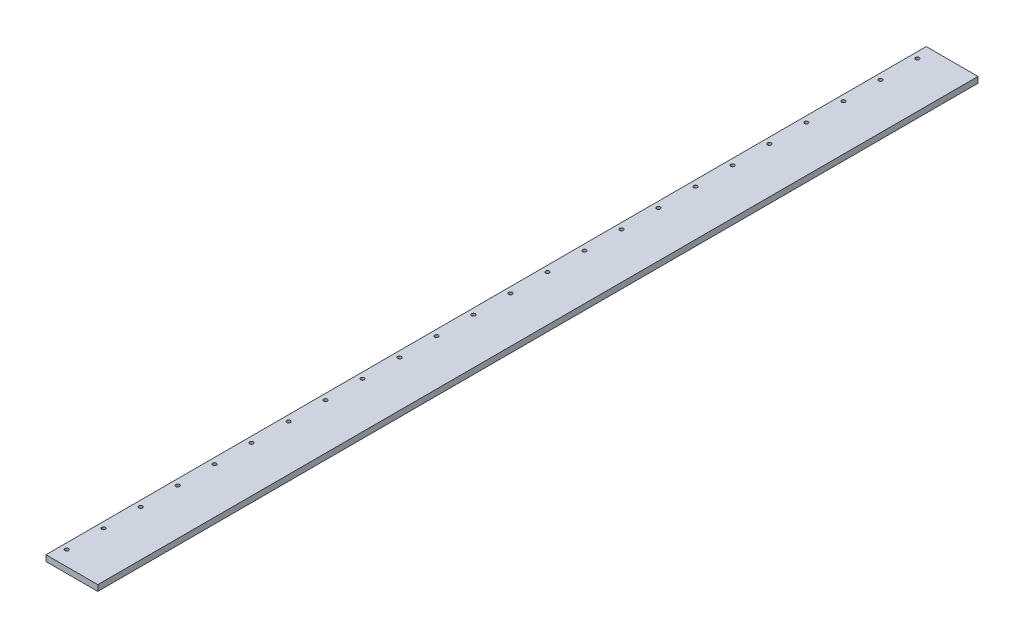
ISO-10303-21;
HEADER;
FILE_DESCRIPTION(('STEP AP214'),'2;1');
FILE_NAME('part.step','',(''),(''),'','','');
FILE_SCHEMA(('AUTOMOTIVE_DESIGN { 1 0 10303 214 1 1 1 1 }'));
ENDSEC;
DATA;
#1=APPLICATION_CONTEXT('core data for automotive mechanical design processes');
#2=APPLICATION_PROTOCOL_DEFINITION('international standard','automotive_design',2000,#1);
#3=PRODUCT_CONTEXT('',#1,'mechanical');
#4=PRODUCT('Part','Part','',(#3));
#5=PRODUCT_RELATED_PRODUCT_CATEGORY('part','',(#4));
#6=PRODUCT_DEFINITION_FORMATION('','',#4);
#7=PRODUCT_DEFINITION_CONTEXT('part definition',#1,'design');
#8=PRODUCT_DEFINITION('design','',#6,#7);
#9=PRODUCT_DEFINITION_SHAPE('','',#8);
#10=(LENGTH_UNIT() NAMED_UNIT(*) SI_UNIT(.MILLI.,.METRE.));
#11=(NAMED_UNIT(*) PLANE_ANGLE_UNIT() SI_UNIT($,.RADIAN.));
#12=(NAMED_UNIT(*) SI_UNIT($,.STERADIAN.) SOLID_ANGLE_UNIT());
#13=UNCERTAINTY_MEASURE_WITH_UNIT(LENGTH_MEASURE(1.E-05),#10,'distance_accuracy_value','');
#14=(GEOMETRIC_REPRESENTATION_CONTEXT(3) GLOBAL_UNCERTAINTY_ASSIGNED_CONTEXT((#13)) GLOBAL_UNIT_ASSIGNED_CONTEXT((#10,
#11,#12)) REPRESENTATION_CONTEXT('',''));
#15=CARTESIAN_POINT('',(0.,0.,0.));
#16=DIRECTION('',(0.,0.,1.));
#17=DIRECTION('',(1.,0.,0.));
#18=AXIS2_PLACEMENT_3D('',#15,#16,#17);
#19=CARTESIAN_POINT('',(-16.5,2.,595.));
#20=DIRECTION('',(0.,-1.,0.));
#21=DIRECTION('',(0.,0.,-1.));
#22=AXIS2_PLACEMENT_3D('',#19,#20,#21);
#23=PLANE('',#22);
#24=CARTESIAN_POINT('',(-12.5,2.,585.));
#25=DIRECTION('',(0.,1.,0.));
#26=DIRECTION('',(0.,0.,1.));
#27=AXIS2_PLACEMENT_3D('',#24,#25,#26);
#28=CIRCLE('',#27,1.24999999999999);
#29=CARTESIAN_POINT('',(-12.5,2.,586.25));
#30=VERTEX_POINT('',#29);
#31=EDGE_CURVE('E318',#30,#30,#28,.T.);
#32=ORIENTED_EDGE('',*,*,#31,.F.);
#33=EDGE_LOOP('',(#32));
#34=FACE_BOUND('',#33,.T.);
#35=CARTESIAN_POINT('',(-12.5,2.,560.));
#36=DIRECTION('',(0.,1.,0.));
#37=DIRECTION('',(0.,0.,1.));
#38=AXIS2_PLACEMENT_3D('',#35,#36,#37);
#39=CIRCLE('',#38,1.24999999999999);
#40=CARTESIAN_POINT('',(-12.5,2.,561.25));
#41=VERTEX_POINT('',#40);
#42=EDGE_CURVE('E310',#41,#41,#39,.T.);
#43=ORIENTED_EDGE('',*,*,#42,.F.);
#44=EDGE_LOOP('',(#43));
#45=FACE_BOUND('',#44,.T.);
#46=CARTESIAN_POINT('',(-12.5,2.,535.));
#47=DIRECTION('',(0.,1.,0.));
#48=DIRECTION('',(0.,0.,1.));
#49=AXIS2_PLACEMENT_3D('',#46,#47,#48);
#50=CIRCLE('',#49,1.24999999999999);
#51=CARTESIAN_POINT('',(-12.5,2.,536.25));
#52=VERTEX_POINT('',#51);
#53=EDGE_CURVE('E302',#52,#52,#50,.T.);
#54=ORIENTED_EDGE('',*,*,#53,.F.);
#55=EDGE_LOOP('',(#54));
#56=FACE_BOUND('',#55,.T.);
#57=CARTESIAN_POINT('',(-12.5,2.,510.));
#58=DIRECTION('',(0.,1.,0.));
#59=DIRECTION('',(0.,0.,1.));
#60=AXIS2_PLACEMENT_3D('',#57,#58,#59);
#61=CIRCLE('',#60,1.24999999999999);
#62=CARTESIAN_POINT('',(-12.5,2.,511.25));
#63=VERTEX_POINT('',#62);
#64=EDGE_CURVE('E294',#63,#63,#61,.T.);
#65=ORIENTED_EDGE('',*,*,#64,.F.);
#66=EDGE_LOOP('',(#65));
#67=FACE_BOUND('',#66,.T.);
#68=CARTESIAN_POINT('',(-12.5,2.,435.));
#69=DIRECTION('',(0.,1.,0.));
#70=DIRECTION('',(0.,0.,1.));
#71=AXIS2_PLACEMENT_3D('',#68,#69,#70);
#72=CIRCLE('',#71,1.24999999999999);
#73=CARTESIAN_POINT('',(-12.5,2.,436.25));
#74=VERTEX_POINT('',#73);
#75=EDGE_CURVE('E270',#74,#74,#72,.T.);
#76=ORIENTED_EDGE('',*,*,#75,.F.);
#77=EDGE_LOOP('',(#76));
#78=FACE_BOUND('',#77,.T.);
#79=CARTESIAN_POINT('',(-12.5,2.,410.));
#80=DIRECTION('',(0.,1.,0.));
#81=DIRECTION('',(0.,0.,1.));
#82=AXIS2_PLACEMENT_3D('',#79,#80,#81);
#83=CIRCLE('',#82,1.24999999999999);
#84=CARTESIAN_POINT('',(-12.5,2.,411.25));
#85=VERTEX_POINT('',#84);
#86=EDGE_CURVE('E262',#85,#85,#83,.T.);
#87=ORIENTED_EDGE('',*,*,#86,.F.);
#88=EDGE_LOOP('',(#87));
#89=FACE_BOUND('',#88,.T.);
#90=CARTESIAN_POINT('',(-12.5,2.,335.));
#91=DIRECTION('',(0.,1.,0.));
#92=DIRECTION('',(0.,0.,1.));
#93=AXIS2_PLACEMENT_3D('',#90,#91,#92);
#94=CIRCLE('',#93,1.24999999999999);
#95=CARTESIAN_POINT('',(-12.5,2.,336.25));
#96=VERTEX_POINT('',#95);
#97=EDGE_CURVE('E238',#96,#96,#94,.T.);
#98=ORIENTED_EDGE('',*,*,#97,.F.);
#99=EDGE_LOOP('',(#98));
#100=FACE_BOUND('',#99,.T.);
#101=CARTESIAN_POINT('',(-12.5,2.,310.));
#102=DIRECTION('',(0.,1.,0.));
#103=DIRECTION('',(0.,0.,1.));
#104=AXIS2_PLACEMENT_3D('',#101,#102,#103);
#105=CIRCLE('',#104,1.24999999999999);
#106=CARTESIAN_POINT('',(-12.5,2.,311.25));
#107=VERTEX_POINT('',#106);
#108=EDGE_CURVE('E230',#107,#107,#105,.T.);
#109=ORIENTED_EDGE('',*,*,#108,.F.);
#110=EDGE_LOOP('',(#109));
#111=FACE_BOUND('',#110,.T.);
#112=CARTESIAN_POINT('',(-12.5,2.,285.));
#113=DIRECTION('',(0.,1.,0.));
#114=DIRECTION('',(0.,0.,1.));
#115=AXIS2_PLACEMENT_3D('',#112,#113,#114);
#116=CIRCLE('',#115,1.24999999999999);
#117=CARTESIAN_POINT('',(-12.5,2.,286.25));
#118=VERTEX_POINT('',#117);
#119=EDGE_CURVE('E222',#118,#118,#116,.T.);
#120=ORIENTED_EDGE('',*,*,#119,.F.);
#121=EDGE_LOOP('',(#120));
#122=FACE_BOUND('',#121,.T.);
#123=CARTESIAN_POINT('',(-12.5,2.,260.));
#124=DIRECTION('',(0.,1.,0.));
#125=DIRECTION('',(0.,0.,1.));
#126=AXIS2_PLACEMENT_3D('',#123,#124,#125);
#127=CIRCLE('',#126,1.24999999999999);
#128=CARTESIAN_POINT('',(-12.5,2.,261.25));
#129=VERTEX_POINT('',#128);
#130=EDGE_CURVE('E214',#129,#129,#127,.T.);
#131=ORIENTED_EDGE('',*,*,#130,.F.);
#132=EDGE_LOOP('',(#131));
#133=FACE_BOUND('',#132,.T.);
#134=CARTESIAN_POINT('',(-12.5,2.,235.));
#135=DIRECTION('',(0.,1.,0.));
#136=DIRECTION('',(0.,0.,1.));
#137=AXIS2_PLACEMENT_3D('',#134,#135,#136);
#138=CIRCLE('',#137,1.24999999999999);
#139=CARTESIAN_POINT('',(-12.5,2.,236.25));
#140=VERTEX_POINT('',#139);
#141=EDGE_CURVE('E206',#140,#140,#138,.T.);
#142=ORIENTED_EDGE('',*,*,#141,.F.);
#143=EDGE_LOOP('',(#142));
#144=FACE_BOUND('',#143,.T.);
#145=CARTESIAN_POINT('',(-12.5,2.,210.));
#146=DIRECTION('',(0.,1.,0.));
#147=DIRECTION('',(0.,0.,1.));
#148=AXIS2_PLACEMENT_3D('',#145,#146,#147);
#149=CIRCLE('',#148,1.24999999999999);
#150=CARTESIAN_POINT('',(-12.5,2.,211.25));
#151=VERTEX_POINT('',#150);
#152=EDGE_CURVE('E198',#151,#151,#149,.T.);
#153=ORIENTED_EDGE('',*,*,#152,.F.);
#154=EDGE_LOOP('',(#153));
#155=FACE_BOUND('',#154,.T.);
#156=CARTESIAN_POINT('',(-12.5,2.,185.));
#157=DIRECTION('',(0.,1.,0.));
#158=DIRECTION('',(0.,0.,1.));
#159=AXIS2_PLACEMENT_3D('',#156,#157,#158);
#160=CIRCLE('',#159,1.24999999999999);
#161=CARTESIAN_POINT('',(-12.5,2.,186.25));
#162=VERTEX_POINT('',#161);
#163=EDGE_CURVE('E190',#162,#162,#160,.T.);
#164=ORIENTED_EDGE('',*,*,#163,.F.);
#165=EDGE_LOOP('',(#164));
#166=FACE_BOUND('',#165,.T.);
#167=CARTESIAN_POINT('',(-12.5,2.,160.));
#168=DIRECTION('',(0.,1.,0.));
#169=DIRECTION('',(0.,0.,1.));
#170=AXIS2_PLACEMENT_3D('',#167,#168,#169);
#171=CIRCLE('',#170,1.24999999999999);
#172=CARTESIAN_POINT('',(-12.5,2.,161.25));
#173=VERTEX_POINT('',#172);
#174=EDGE_CURVE('E182',#173,#173,#171,.T.);
#175=ORIENTED_EDGE('',*,*,#174,.F.);
#176=EDGE_LOOP('',(#175));
#177=FACE_BOUND('',#176,.T.);
#178=CARTESIAN_POINT('',(-12.5,2.,135.));
#179=DIRECTION('',(0.,1.,0.));
#180=DIRECTION('',(0.,0.,1.));
#181=AXIS2_PLACEMENT_3D('',#178,#179,#180);
#182=CIRCLE('',#181,1.24999999999999);
#183=CARTESIAN_POINT('',(-12.5,2.,136.25));
#184=VERTEX_POINT('',#183);
#185=EDGE_CURVE('E174',#184,#184,#182,.T.);
#186=ORIENTED_EDGE('',*,*,#185,.F.);
#187=EDGE_LOOP('',(#186));
#188=FACE_BOUND('',#187,.T.);
#189=CARTESIAN_POINT('',(-12.5,2.,110.));
#190=DIRECTION('',(0.,1.,0.));
#191=DIRECTION('',(0.,0.,1.));
#192=AXIS2_PLACEMENT_3D('',#189,#190,#191);
#193=CIRCLE('',#192,1.24999999999999);
#194=CARTESIAN_POINT('',(-12.5,2.,111.25));
#195=VERTEX_POINT('',#194);
#196=EDGE_CURVE('E166',#195,#195,#193,.T.);
#197=ORIENTED_EDGE('',*,*,#196,.F.);
#198=EDGE_LOOP('',(#197));
#199=FACE_BOUND('',#198,.T.);
#200=CARTESIAN_POINT('',(-12.5,2.,85.));
#201=DIRECTION('',(0.,1.,0.));
#202=DIRECTION('',(0.,0.,1.));
#203=AXIS2_PLACEMENT_3D('',#200,#201,#202);
#204=CIRCLE('',#203,1.24999999999999);
#205=CARTESIAN_POINT('',(-12.5,2.,86.25));
#206=VERTEX_POINT('',#205);
#207=EDGE_CURVE('E158',#206,#206,#204,.T.);
#208=ORIENTED_EDGE('',*,*,#207,.F.);
#209=EDGE_LOOP('',(#208));
#210=FACE_BOUND('',#209,.T.);
#211=CARTESIAN_POINT('',(-12.5,2.,60.));
#212=DIRECTION('',(0.,1.,0.));
#213=DIRECTION('',(0.,0.,1.));
#214=AXIS2_PLACEMENT_3D('',#211,#212,#213);
#215=CIRCLE('',#214,1.24999999999999);
#216=CARTESIAN_POINT('',(-12.5,2.,61.25));
#217=VERTEX_POINT('',#216);
#218=EDGE_CURVE('E150',#217,#217,#215,.T.);
#219=ORIENTED_EDGE('',*,*,#218,.F.);
#220=EDGE_LOOP('',(#219));
#221=FACE_BOUND('',#220,.T.);
#222=CARTESIAN_POINT('',(-12.5,2.,10.));
#223=DIRECTION('',(0.,1.,0.));
#224=DIRECTION('',(0.,0.,1.));
#225=AXIS2_PLACEMENT_3D('',#222,#223,#224);
#226=CIRCLE('',#225,1.24999999999999);
#227=CARTESIAN_POINT('',(-12.5,2.,11.25));
#228=VERTEX_POINT('',#227);
#229=EDGE_CURVE('E134',#228,#228,#226,.T.);
#230=ORIENTED_EDGE('',*,*,#229,.F.);
#231=EDGE_LOOP('',(#230));
#232=FACE_BOUND('',#231,.T.);
#233=DIRECTION('',(-1.,0.,0.));
#234=VECTOR('',#233,1.);
#235=CARTESIAN_POINT('',(-16.5,2.,0.));
#236=LINE('',#235,#234);
#237=CARTESIAN_POINT('',(18.5,2.,0.));
#238=VERTEX_POINT('',#237);
#239=CARTESIAN_POINT('',(-16.5,2.,0.));
#240=VERTEX_POINT('',#239);
#241=EDGE_CURVE('E99',#238,#240,#236,.T.);
#242=ORIENTED_EDGE('',*,*,#241,.T.);
#243=DIRECTION('',(0.,0.,-1.));
#244=VECTOR('',#243,1.);
#245=CARTESIAN_POINT('',(-16.5,2.,595.));
#246=LINE('',#245,#244);
#247=CARTESIAN_POINT('',(-16.5,2.,595.));
#248=VERTEX_POINT('',#247);
#249=EDGE_CURVE('E51',#248,#240,#246,.T.);
#250=ORIENTED_EDGE('',*,*,#249,.F.);
#251=DIRECTION('',(-1.,0.,0.));
#252=VECTOR('',#251,1.);
#253=CARTESIAN_POINT('',(-16.5,2.,595.));
#254=LINE('',#253,#252);
#255=CARTESIAN_POINT('',(18.5,2.,595.));
#256=VERTEX_POINT('',#255);
#257=EDGE_CURVE('E89',#256,#248,#254,.T.);
#258=ORIENTED_EDGE('',*,*,#257,.F.);
#259=DIRECTION('',(0.,0.,-1.));
#260=VECTOR('',#259,1.);
#261=CARTESIAN_POINT('',(18.5,2.,595.));
#262=LINE('',#261,#260);
#263=EDGE_CURVE('E11',#256,#238,#262,.T.);
#264=ORIENTED_EDGE('',*,*,#263,.T.);
#265=EDGE_LOOP('',(#242,#250,#258,#264));
#266=FACE_BOUND('',#265,.T.);
#267=CARTESIAN_POINT('',(-12.5,2.,35.));
#268=DIRECTION('',(0.,1.,0.));
#269=DIRECTION('',(0.,0.,1.));
#270=AXIS2_PLACEMENT_3D('',#267,#268,#269);
#271=CIRCLE('',#270,1.24999999999999);
#272=CARTESIAN_POINT('',(-12.5,2.,36.25));
#273=VERTEX_POINT('',#272);
#274=EDGE_CURVE('E142',#273,#273,#271,.T.);
#275=ORIENTED_EDGE('',*,*,#274,.F.);
#276=EDGE_LOOP('',(#275));
#277=FACE_BOUND('',#276,.T.);
#278=CARTESIAN_POINT('',(-12.5,2.,360.));
#279=DIRECTION('',(0.,1.,0.));
#280=DIRECTION('',(0.,0.,1.));
#281=AXIS2_PLACEMENT_3D('',#278,#279,#280);
#282=CIRCLE('',#281,1.24999999999999);
#283=CARTESIAN_POINT('',(-12.5,2.,361.25));
#284=VERTEX_POINT('',#283);
#285=EDGE_CURVE('E246',#284,#284,#282,.T.);
#286=ORIENTED_EDGE('',*,*,#285,.F.);
#287=EDGE_LOOP('',(#286));
#288=FACE_BOUND('',#287,.T.);
#289=CARTESIAN_POINT('',(-12.5,2.,385.));
#290=DIRECTION('',(0.,1.,0.));
#291=DIRECTION('',(0.,0.,1.));
#292=AXIS2_PLACEMENT_3D('',#289,#290,#291);
#293=CIRCLE('',#292,1.24999999999999);
#294=CARTESIAN_POINT('',(-12.5,2.,386.25));
#295=VERTEX_POINT('',#294);
#296=EDGE_CURVE('E254',#295,#295,#293,.T.);
#297=ORIENTED_EDGE('',*,*,#296,.F.);
#298=EDGE_LOOP('',(#297));
#299=FACE_BOUND('',#298,.T.);
#300=CARTESIAN_POINT('',(-12.5,2.,460.));
#301=DIRECTION('',(0.,1.,0.));
#302=DIRECTION('',(0.,0.,1.));
#303=AXIS2_PLACEMENT_3D('',#300,#301,#302);
#304=CIRCLE('',#303,1.24999999999999);
#305=CARTESIAN_POINT('',(-12.5,2.,461.25));
#306=VERTEX_POINT('',#305);
#307=EDGE_CURVE('E278',#306,#306,#304,.T.);
#308=ORIENTED_EDGE('',*,*,#307,.F.);
#309=EDGE_LOOP('',(#308));
#310=FACE_BOUND('',#309,.T.);
#311=CARTESIAN_POINT('',(-12.5,2.,485.));
#312=DIRECTION('',(0.,1.,0.));
#313=DIRECTION('',(0.,0.,1.));
#314=AXIS2_PLACEMENT_3D('',#311,#312,#313);
#315=CIRCLE('',#314,1.24999999999999);
#316=CARTESIAN_POINT('',(-12.5,2.,486.25));
#317=VERTEX_POINT('',#316);
#318=EDGE_CURVE('E286',#317,#317,#315,.T.);
#319=ORIENTED_EDGE('',*,*,#318,.F.);
#320=EDGE_LOOP('',(#319));
#321=FACE_BOUND('',#320,.T.);
#322=ADVANCED_FACE('F41',(#34,#45,#56,#67,#78,#89,#100,#111,#122,#133,#144,#155,#166,#177,#188,
#199,#210,#221,#232,#266,#277,#288,#299,#310,#321),#23,.F.);
#323=CARTESIAN_POINT('',(18.5,-2.,595.));
#324=DIRECTION('',(-1.,0.,0.));
#325=DIRECTION('',(0.,0.,1.));
#326=AXIS2_PLACEMENT_3D('',#323,#324,#325);
#327=PLANE('',#326);
#328=DIRECTION('',(0.,1.,0.));
#329=VECTOR('',#328,1.);
#330=CARTESIAN_POINT('',(18.5,-2.,0.));
#331=LINE('',#330,#329);
#332=CARTESIAN_POINT('',(18.5,-2.,0.));
#333=VERTEX_POINT('',#332);
#334=EDGE_CURVE('E110',#333,#238,#331,.T.);
#335=ORIENTED_EDGE('',*,*,#334,.T.);
#336=ORIENTED_EDGE('',*,*,#263,.F.);
#337=DIRECTION('',(0.,1.,0.));
#338=VECTOR('',#337,1.);
#339=CARTESIAN_POINT('',(18.5,-2.,595.));
#340=LINE('',#339,#338);
#341=CARTESIAN_POINT('',(18.5,-2.,595.));
#342=VERTEX_POINT('',#341);
#343=EDGE_CURVE('E94',#342,#256,#340,.T.);
#344=ORIENTED_EDGE('',*,*,#343,.F.);
#345=DIRECTION('',(0.,0.,-1.));
#346=VECTOR('',#345,1.);
#347=CARTESIAN_POINT('',(18.5,-2.,595.));
#348=LINE('',#347,#346);
#349=EDGE_CURVE('E106',#342,#333,#348,.T.);
#350=ORIENTED_EDGE('',*,*,#349,.T.);
#351=EDGE_LOOP('',(#335,#336,#344,#350));
#352=FACE_BOUND('',#351,.T.);
#353=ADVANCED_FACE('F43',(#352),#327,.F.);
#354=CARTESIAN_POINT('',(-16.5,-2.,595.));
#355=DIRECTION('',(1.,0.,0.));
#356=DIRECTION('',(0.,0.,-1.));
#357=AXIS2_PLACEMENT_3D('',#354,#355,#356);
#358=PLANE('',#357);
#359=DIRECTION('',(0.,-1.,0.));
#360=VECTOR('',#359,1.);
#361=CARTESIAN_POINT('',(-16.5,-2.,0.));
#362=LINE('',#361,#360);
#363=CARTESIAN_POINT('',(-16.5,-2.,0.));
#364=VERTEX_POINT('',#363);
#365=EDGE_CURVE('E76',#240,#364,#362,.T.);
#366=ORIENTED_EDGE('',*,*,#365,.T.);
#367=DIRECTION('',(0.,0.,-1.));
#368=VECTOR('',#367,1.);
#369=CARTESIAN_POINT('',(-16.5,-2.,595.));
#370=LINE('',#369,#368);
#371=CARTESIAN_POINT('',(-16.5,-2.,595.));
#372=VERTEX_POINT('',#371);
#373=EDGE_CURVE('E101',#372,#364,#370,.T.);
#374=ORIENTED_EDGE('',*,*,#373,.F.);
#375=DIRECTION('',(0.,-1.,0.));
#376=VECTOR('',#375,1.);
#377=CARTESIAN_POINT('',(-16.5,-2.,595.));
#378=LINE('',#377,#376);
#379=EDGE_CURVE('E92',#248,#372,#378,.T.);
#380=ORIENTED_EDGE('',*,*,#379,.F.);
#381=ORIENTED_EDGE('',*,*,#249,.T.);
#382=EDGE_LOOP('',(#366,#374,#380,#381));
#383=FACE_BOUND('',#382,.T.);
#384=ADVANCED_FACE('F102',(#383),#358,.F.);
#385=CARTESIAN_POINT('',(-16.5,-2.,595.));
#386=DIRECTION('',(0.,1.,0.));
#387=DIRECTION('',(0.,0.,1.));
#388=AXIS2_PLACEMENT_3D('',#385,#386,#387);
#389=PLANE('',#388);
#390=CARTESIAN_POINT('',(-12.5,-2.,585.));
#391=DIRECTION('',(0.,1.,0.));
#392=DIRECTION('',(0.,0.,1.));
#393=AXIS2_PLACEMENT_3D('',#390,#391,#392);
#394=CIRCLE('',#393,1.24999999999999);
#395=CARTESIAN_POINT('',(-12.5,-2.,586.25));
#396=VERTEX_POINT('',#395);
#397=EDGE_CURVE('E314',#396,#396,#394,.T.);
#398=ORIENTED_EDGE('',*,*,#397,.T.);
#399=EDGE_LOOP('',(#398));
#400=FACE_BOUND('',#399,.T.);
#401=CARTESIAN_POINT('',(-12.5,-2.,560.));
#402=DIRECTION('',(0.,1.,0.));
#403=DIRECTION('',(0.,0.,1.));
#404=AXIS2_PLACEMENT_3D('',#401,#402,#403);
#405=CIRCLE('',#404,1.24999999999999);
#406=CARTESIAN_POINT('',(-12.5,-2.,561.25));
#407=VERTEX_POINT('',#406);
#408=EDGE_CURVE('E306',#407,#407,#405,.T.);
#409=ORIENTED_EDGE('',*,*,#408,.T.);
#410=EDGE_LOOP('',(#409));
#411=FACE_BOUND('',#410,.T.);
#412=CARTESIAN_POINT('',(-12.5,-2.,535.));
#413=DIRECTION('',(0.,1.,0.));
#414=DIRECTION('',(0.,0.,1.));
#415=AXIS2_PLACEMENT_3D('',#412,#413,#414);
#416=CIRCLE('',#415,1.24999999999999);
#417=CARTESIAN_POINT('',(-12.5,-2.,536.25));
#418=VERTEX_POINT('',#417);
#419=EDGE_CURVE('E298',#418,#418,#416,.T.);
#420=ORIENTED_EDGE('',*,*,#419,.T.);
#421=EDGE_LOOP('',(#420));
#422=FACE_BOUND('',#421,.T.);
#423=CARTESIAN_POINT('',(-12.5,-2.,510.));
#424=DIRECTION('',(0.,1.,0.));
#425=DIRECTION('',(0.,0.,1.));
#426=AXIS2_PLACEMENT_3D('',#423,#424,#425);
#427=CIRCLE('',#426,1.24999999999999);
#428=CARTESIAN_POINT('',(-12.5,-2.,511.25));
#429=VERTEX_POINT('',#428);
#430=EDGE_CURVE('E290',#429,#429,#427,.T.);
#431=ORIENTED_EDGE('',*,*,#430,.T.);
#432=EDGE_LOOP('',(#431));
#433=FACE_BOUND('',#432,.T.);
#434=CARTESIAN_POINT('',(-12.5,-2.,485.));
#435=DIRECTION('',(0.,1.,0.));
#436=DIRECTION('',(0.,0.,1.));
#437=AXIS2_PLACEMENT_3D('',#434,#435,#436);
#438=CIRCLE('',#437,1.24999999999999);
#439=CARTESIAN_POINT('',(-12.5,-2.,486.25));
#440=VERTEX_POINT('',#439);
#441=EDGE_CURVE('E282',#440,#440,#438,.T.);
#442=ORIENTED_EDGE('',*,*,#441,.T.);
#443=EDGE_LOOP('',(#442));
#444=FACE_BOUND('',#443,.T.);
#445=CARTESIAN_POINT('',(-12.5,-2.,460.));
#446=DIRECTION('',(0.,1.,0.));
#447=DIRECTION('',(0.,0.,1.));
#448=AXIS2_PLACEMENT_3D('',#445,#446,#447);
#449=CIRCLE('',#448,1.24999999999999);
#450=CARTESIAN_POINT('',(-12.5,-2.,461.25));
#451=VERTEX_POINT('',#450);
#452=EDGE_CURVE('E274',#451,#451,#449,.T.);
#453=ORIENTED_EDGE('',*,*,#452,.T.);
#454=EDGE_LOOP('',(#453));
#455=FACE_BOUND('',#454,.T.);
#456=CARTESIAN_POINT('',(-12.5,-2.,435.));
#457=DIRECTION('',(0.,1.,0.));
#458=DIRECTION('',(0.,0.,1.));
#459=AXIS2_PLACEMENT_3D('',#456,#457,#458);
#460=CIRCLE('',#459,1.24999999999999);
#461=CARTESIAN_POINT('',(-12.5,-2.,436.25));
#462=VERTEX_POINT('',#461);
#463=EDGE_CURVE('E266',#462,#462,#460,.T.);
#464=ORIENTED_EDGE('',*,*,#463,.T.);
#465=EDGE_LOOP('',(#464));
#466=FACE_BOUND('',#465,.T.);
#467=CARTESIAN_POINT('',(-12.5,-2.,410.));
#468=DIRECTION('',(0.,1.,0.));
#469=DIRECTION('',(0.,0.,1.));
#470=AXIS2_PLACEMENT_3D('',#467,#468,#469);
#471=CIRCLE('',#470,1.24999999999999);
#472=CARTESIAN_POINT('',(-12.5,-2.,411.25));
#473=VERTEX_POINT('',#472);
#474=EDGE_CURVE('E258',#473,#473,#471,.T.);
#475=ORIENTED_EDGE('',*,*,#474,.T.);
#476=EDGE_LOOP('',(#475));
#477=FACE_BOUND('',#476,.T.);
#478=CARTESIAN_POINT('',(-12.5,-2.,385.));
#479=DIRECTION('',(0.,1.,0.));
#480=DIRECTION('',(0.,0.,1.));
#481=AXIS2_PLACEMENT_3D('',#478,#479,#480);
#482=CIRCLE('',#481,1.24999999999999);
#483=CARTESIAN_POINT('',(-12.5,-2.,386.25));
#484=VERTEX_POINT('',#483);
#485=EDGE_CURVE('E250',#484,#484,#482,.T.);
#486=ORIENTED_EDGE('',*,*,#485,.T.);
#487=EDGE_LOOP('',(#486));
#488=FACE_BOUND('',#487,.T.);
#489=CARTESIAN_POINT('',(-12.5,-2.,360.));
#490=DIRECTION('',(0.,1.,0.));
#491=DIRECTION('',(0.,0.,1.));
#492=AXIS2_PLACEMENT_3D('',#489,#490,#491);
#493=CIRCLE('',#492,1.24999999999999);
#494=CARTESIAN_POINT('',(-12.5,-2.,361.25));
#495=VERTEX_POINT('',#494);
#496=EDGE_CURVE('E242',#495,#495,#493,.T.);
#497=ORIENTED_EDGE('',*,*,#496,.T.);
#498=EDGE_LOOP('',(#497));
#499=FACE_BOUND('',#498,.T.);
#500=CARTESIAN_POINT('',(-12.5,-2.,335.));
#501=DIRECTION('',(0.,1.,0.));
#502=DIRECTION('',(0.,0.,1.));
#503=AXIS2_PLACEMENT_3D('',#500,#501,#502);
#504=CIRCLE('',#503,1.24999999999999);
#505=CARTESIAN_POINT('',(-12.5,-2.,336.25));
#506=VERTEX_POINT('',#505);
#507=EDGE_CURVE('E234',#506,#506,#504,.T.);
#508=ORIENTED_EDGE('',*,*,#507,.T.);
#509=EDGE_LOOP('',(#508));
#510=FACE_BOUND('',#509,.T.);
#511=CARTESIAN_POINT('',(-12.5,-2.,310.));
#512=DIRECTION('',(0.,1.,0.));
#513=DIRECTION('',(0.,0.,1.));
#514=AXIS2_PLACEMENT_3D('',#511,#512,#513);
#515=CIRCLE('',#514,1.24999999999999);
#516=CARTESIAN_POINT('',(-12.5,-2.,311.25));
#517=VERTEX_POINT('',#516);
#518=EDGE_CURVE('E226',#517,#517,#515,.T.);
#519=ORIENTED_EDGE('',*,*,#518,.T.);
#520=EDGE_LOOP('',(#519));
#521=FACE_BOUND('',#520,.T.);
#522=CARTESIAN_POINT('',(-12.5,-2.,285.));
#523=DIRECTION('',(0.,1.,0.));
#524=DIRECTION('',(0.,0.,1.));
#525=AXIS2_PLACEMENT_3D('',#522,#523,#524);
#526=CIRCLE('',#525,1.24999999999999);
#527=CARTESIAN_POINT('',(-12.5,-2.,286.25));
#528=VERTEX_POINT('',#527);
#529=EDGE_CURVE('E218',#528,#528,#526,.T.);
#530=ORIENTED_EDGE('',*,*,#529,.T.);
#531=EDGE_LOOP('',(#530));
#532=FACE_BOUND('',#531,.T.);
#533=CARTESIAN_POINT('',(-12.5,-2.,260.));
#534=DIRECTION('',(0.,1.,0.));
#535=DIRECTION('',(0.,0.,1.));
#536=AXIS2_PLACEMENT_3D('',#533,#534,#535);
#537=CIRCLE('',#536,1.24999999999999);
#538=CARTESIAN_POINT('',(-12.5,-2.,261.25));
#539=VERTEX_POINT('',#538);
#540=EDGE_CURVE('E210',#539,#539,#537,.T.);
#541=ORIENTED_EDGE('',*,*,#540,.T.);
#542=EDGE_LOOP('',(#541));
#543=FACE_BOUND('',#542,.T.);
#544=CARTESIAN_POINT('',(-12.5,-2.,235.));
#545=DIRECTION('',(0.,1.,0.));
#546=DIRECTION('',(0.,0.,1.));
#547=AXIS2_PLACEMENT_3D('',#544,#545,#546);
#548=CIRCLE('',#547,1.24999999999999);
#549=CARTESIAN_POINT('',(-12.5,-2.,236.25));
#550=VERTEX_POINT('',#549);
#551=EDGE_CURVE('E202',#550,#550,#548,.T.);
#552=ORIENTED_EDGE('',*,*,#551,.T.);
#553=EDGE_LOOP('',(#552));
#554=FACE_BOUND('',#553,.T.);
#555=CARTESIAN_POINT('',(-12.5,-2.,210.));
#556=DIRECTION('',(0.,1.,0.));
#557=DIRECTION('',(0.,0.,1.));
#558=AXIS2_PLACEMENT_3D('',#555,#556,#557);
#559=CIRCLE('',#558,1.24999999999999);
#560=CARTESIAN_POINT('',(-12.5,-2.,211.25));
#561=VERTEX_POINT('',#560);
#562=EDGE_CURVE('E194',#561,#561,#559,.T.);
#563=ORIENTED_EDGE('',*,*,#562,.T.);
#564=EDGE_LOOP('',(#563));
#565=FACE_BOUND('',#564,.T.);
#566=CARTESIAN_POINT('',(-12.5,-2.,185.));
#567=DIRECTION('',(0.,1.,0.));
#568=DIRECTION('',(0.,0.,1.));
#569=AXIS2_PLACEMENT_3D('',#566,#567,#568);
#570=CIRCLE('',#569,1.24999999999999);
#571=CARTESIAN_POINT('',(-12.5,-2.,186.25));
#572=VERTEX_POINT('',#571);
#573=EDGE_CURVE('E186',#572,#572,#570,.T.);
#574=ORIENTED_EDGE('',*,*,#573,.T.);
#575=EDGE_LOOP('',(#574));
#576=FACE_BOUND('',#575,.T.);
#577=CARTESIAN_POINT('',(-12.5,-2.,160.));
#578=DIRECTION('',(0.,1.,0.));
#579=DIRECTION('',(0.,0.,1.));
#580=AXIS2_PLACEMENT_3D('',#577,#578,#579);
#581=CIRCLE('',#580,1.24999999999999);
#582=CARTESIAN_POINT('',(-12.5,-2.,161.25));
#583=VERTEX_POINT('',#582);
#584=EDGE_CURVE('E178',#583,#583,#581,.T.);
#585=ORIENTED_EDGE('',*,*,#584,.T.);
#586=EDGE_LOOP('',(#585));
#587=FACE_BOUND('',#586,.T.);
#588=CARTESIAN_POINT('',(-12.5,-2.,135.));
#589=DIRECTION('',(0.,1.,0.));
#590=DIRECTION('',(0.,0.,1.));
#591=AXIS2_PLACEMENT_3D('',#588,#589,#590);
#592=CIRCLE('',#591,1.24999999999999);
#593=CARTESIAN_POINT('',(-12.5,-2.,136.25));
#594=VERTEX_POINT('',#593);
#595=EDGE_CURVE('E170',#594,#594,#592,.T.);
#596=ORIENTED_EDGE('',*,*,#595,.T.);
#597=EDGE_LOOP('',(#596));
#598=FACE_BOUND('',#597,.T.);
#599=CARTESIAN_POINT('',(-12.5,-2.,110.));
#600=DIRECTION('',(0.,1.,0.));
#601=DIRECTION('',(0.,0.,1.));
#602=AXIS2_PLACEMENT_3D('',#599,#600,#601);
#603=CIRCLE('',#602,1.24999999999999);
#604=CARTESIAN_POINT('',(-12.5,-2.,111.25));
#605=VERTEX_POINT('',#604);
#606=EDGE_CURVE('E162',#605,#605,#603,.T.);
#607=ORIENTED_EDGE('',*,*,#606,.T.);
#608=EDGE_LOOP('',(#607));
#609=FACE_BOUND('',#608,.T.);
#610=CARTESIAN_POINT('',(-12.5,-2.,85.));
#611=DIRECTION('',(0.,1.,0.));
#612=DIRECTION('',(0.,0.,1.));
#613=AXIS2_PLACEMENT_3D('',#610,#611,#612);
#614=CIRCLE('',#613,1.24999999999999);
#615=CARTESIAN_POINT('',(-12.5,-2.,86.25));
#616=VERTEX_POINT('',#615);
#617=EDGE_CURVE('E154',#616,#616,#614,.T.);
#618=ORIENTED_EDGE('',*,*,#617,.T.);
#619=EDGE_LOOP('',(#618));
#620=FACE_BOUND('',#619,.T.);
#621=CARTESIAN_POINT('',(-12.5,-2.,60.));
#622=DIRECTION('',(0.,1.,0.));
#623=DIRECTION('',(0.,0.,1.));
#624=AXIS2_PLACEMENT_3D('',#621,#622,#623);
#625=CIRCLE('',#624,1.24999999999999);
#626=CARTESIAN_POINT('',(-12.5,-2.,61.25));
#627=VERTEX_POINT('',#626);
#628=EDGE_CURVE('E146',#627,#627,#625,.T.);
#629=ORIENTED_EDGE('',*,*,#628,.T.);
#630=EDGE_LOOP('',(#629));
#631=FACE_BOUND('',#630,.T.);
#632=CARTESIAN_POINT('',(-12.5,-2.,35.));
#633=DIRECTION('',(0.,1.,0.));
#634=DIRECTION('',(0.,0.,1.));
#635=AXIS2_PLACEMENT_3D('',#632,#633,#634);
#636=CIRCLE('',#635,1.24999999999999);
#637=CARTESIAN_POINT('',(-12.5,-2.,36.25));
#638=VERTEX_POINT('',#637);
#639=EDGE_CURVE('E138',#638,#638,#636,.T.);
#640=ORIENTED_EDGE('',*,*,#639,.T.);
#641=EDGE_LOOP('',(#640));
#642=FACE_BOUND('',#641,.T.);
#643=CARTESIAN_POINT('',(-12.5,-2.,10.));
#644=DIRECTION('',(0.,1.,0.));
#645=DIRECTION('',(0.,0.,1.));
#646=AXIS2_PLACEMENT_3D('',#643,#644,#645);
#647=CIRCLE('',#646,1.24999999999999);
#648=CARTESIAN_POINT('',(-12.5,-2.,11.25));
#649=VERTEX_POINT('',#648);
#650=EDGE_CURVE('E114',#649,#649,#647,.T.);
#651=ORIENTED_EDGE('',*,*,#650,.T.);
#652=EDGE_LOOP('',(#651));
#653=FACE_BOUND('',#652,.T.);
#654=DIRECTION('',(1.,0.,0.));
#655=VECTOR('',#654,1.);
#656=CARTESIAN_POINT('',(-16.5,-2.,0.));
#657=LINE('',#656,#655);
#658=EDGE_CURVE('E82',#364,#333,#657,.T.);
#659=ORIENTED_EDGE('',*,*,#658,.T.);
#660=ORIENTED_EDGE('',*,*,#349,.F.);
#661=DIRECTION('',(1.,0.,0.));
#662=VECTOR('',#661,1.);
#663=CARTESIAN_POINT('',(-16.5,-2.,595.));
#664=LINE('',#663,#662);
#665=EDGE_CURVE('E59',#372,#342,#664,.T.);
#666=ORIENTED_EDGE('',*,*,#665,.F.);
#667=ORIENTED_EDGE('',*,*,#373,.T.);
#668=EDGE_LOOP('',(#659,#660,#666,#667));
#669=FACE_BOUND('',#668,.T.);
#670=ADVANCED_FACE('F124',(#400,#411,#422,#433,#444,#455,#466,#477,#488,#499,#510,#521,#532,
#543,#554,#565,#576,#587,#598,#609,#620,#631,#642,#653,#669),#389,.F.);
#671=CARTESIAN_POINT('',(0.,0.,595.));
#672=DIRECTION('',(0.,0.,-1.));
#673=DIRECTION('',(-1.,0.,0.));
#674=AXIS2_PLACEMENT_3D('',#671,#672,#673);
#675=PLANE('',#674);
#676=ORIENTED_EDGE('',*,*,#343,.T.);
#677=ORIENTED_EDGE('',*,*,#257,.T.);
#678=ORIENTED_EDGE('',*,*,#379,.T.);
#679=ORIENTED_EDGE('',*,*,#665,.T.);
#680=EDGE_LOOP('',(#676,#677,#678,#679));
#681=FACE_BOUND('',#680,.T.);
#682=ADVANCED_FACE('F90',(#681),#675,.F.);
#683=CARTESIAN_POINT('',(0.,0.,0.));
#684=DIRECTION('',(0.,0.,-1.));
#685=DIRECTION('',(-1.,0.,0.));
#686=AXIS2_PLACEMENT_3D('',#683,#684,#685);
#687=PLANE('',#686);
#688=ORIENTED_EDGE('',*,*,#334,.F.);
#689=ORIENTED_EDGE('',*,*,#658,.F.);
#690=ORIENTED_EDGE('',*,*,#365,.F.);
#691=ORIENTED_EDGE('',*,*,#241,.F.);
#692=EDGE_LOOP('',(#688,#689,#690,#691));
#693=FACE_BOUND('',#692,.T.);
#694=ADVANCED_FACE('F127',(#693),#687,.T.);
#695=CARTESIAN_POINT('',(-12.5,2.,10.));
#696=DIRECTION('',(0.,1.,0.));
#697=DIRECTION('',(0.,0.,1.));
#698=AXIS2_PLACEMENT_3D('',#695,#696,#697);
#699=CYLINDRICAL_SURFACE('',#698,1.24999999999999);
#700=ORIENTED_EDGE('',*,*,#650,.F.);
#701=EDGE_LOOP('',(#700));
#702=FACE_BOUND('',#701,.T.);
#703=ORIENTED_EDGE('',*,*,#229,.T.);
#704=EDGE_LOOP('',(#703));
#705=FACE_BOUND('',#704,.T.);
#706=ADVANCED_FACE('F363',(#702,#705),#699,.F.);
#707=CARTESIAN_POINT('',(-12.5,2.,35.));
#708=DIRECTION('',(0.,1.,0.));
#709=DIRECTION('',(0.,0.,1.));
#710=AXIS2_PLACEMENT_3D('',#707,#708,#709);
#711=CYLINDRICAL_SURFACE('',#710,1.24999999999999);
#712=ORIENTED_EDGE('',*,*,#639,.F.);
#713=EDGE_LOOP('',(#712));
#714=FACE_BOUND('',#713,.T.);
#715=ORIENTED_EDGE('',*,*,#274,.T.);
#716=EDGE_LOOP('',(#715));
#717=FACE_BOUND('',#716,.T.);
#718=ADVANCED_FACE('F365',(#714,#717),#711,.F.);
#719=CARTESIAN_POINT('',(-12.5,2.,60.));
#720=DIRECTION('',(0.,1.,0.));
#721=DIRECTION('',(0.,0.,1.));
#722=AXIS2_PLACEMENT_3D('',#719,#720,#721);
#723=CYLINDRICAL_SURFACE('',#722,1.24999999999999);
#724=ORIENTED_EDGE('',*,*,#628,.F.);
#725=EDGE_LOOP('',(#724));
#726=FACE_BOUND('',#725,.T.);
#727=ORIENTED_EDGE('',*,*,#218,.T.);
#728=EDGE_LOOP('',(#727));
#729=FACE_BOUND('',#728,.T.);
#730=ADVANCED_FACE('F372',(#726,#729),#723,.F.);
#731=CARTESIAN_POINT('',(-12.5,2.,85.));
#732=DIRECTION('',(0.,1.,0.));
#733=DIRECTION('',(0.,0.,1.));
#734=AXIS2_PLACEMENT_3D('',#731,#732,#733);
#735=CYLINDRICAL_SURFACE('',#734,1.24999999999999);
#736=ORIENTED_EDGE('',*,*,#617,.F.);
#737=EDGE_LOOP('',(#736));
#738=FACE_BOUND('',#737,.T.);
#739=ORIENTED_EDGE('',*,*,#207,.T.);
#740=EDGE_LOOP('',(#739));
#741=FACE_BOUND('',#740,.T.);
#742=ADVANCED_FACE('F423',(#738,#741),#735,.F.);
#743=CARTESIAN_POINT('',(-12.5,2.,110.));
#744=DIRECTION('',(0.,1.,0.));
#745=DIRECTION('',(0.,0.,1.));
#746=AXIS2_PLACEMENT_3D('',#743,#744,#745);
#747=CYLINDRICAL_SURFACE('',#746,1.24999999999999);
#748=ORIENTED_EDGE('',*,*,#606,.F.);
#749=EDGE_LOOP('',(#748));
#750=FACE_BOUND('',#749,.T.);
#751=ORIENTED_EDGE('',*,*,#196,.T.);
#752=EDGE_LOOP('',(#751));
#753=FACE_BOUND('',#752,.T.);
#754=ADVANCED_FACE('F433',(#750,#753),#747,.F.);
#755=CARTESIAN_POINT('',(-12.5,2.,135.));
#756=DIRECTION('',(0.,1.,0.));
#757=DIRECTION('',(0.,0.,1.));
#758=AXIS2_PLACEMENT_3D('',#755,#756,#757);
#759=CYLINDRICAL_SURFACE('',#758,1.24999999999999);
#760=ORIENTED_EDGE('',*,*,#595,.F.);
#761=EDGE_LOOP('',(#760));
#762=FACE_BOUND('',#761,.T.);
#763=ORIENTED_EDGE('',*,*,#185,.T.);
#764=EDGE_LOOP('',(#763));
#765=FACE_BOUND('',#764,.T.);
#766=ADVANCED_FACE('F444',(#762,#765),#759,.F.);
#767=CARTESIAN_POINT('',(-12.5,2.,160.));
#768=DIRECTION('',(0.,1.,0.));
#769=DIRECTION('',(0.,0.,1.));
#770=AXIS2_PLACEMENT_3D('',#767,#768,#769);
#771=CYLINDRICAL_SURFACE('',#770,1.24999999999999);
#772=ORIENTED_EDGE('',*,*,#584,.F.);
#773=EDGE_LOOP('',(#772));
#774=FACE_BOUND('',#773,.T.);
#775=ORIENTED_EDGE('',*,*,#174,.T.);
#776=EDGE_LOOP('',(#775));
#777=FACE_BOUND('',#776,.T.);
#778=ADVANCED_FACE('F455',(#774,#777),#771,.F.);
#779=CARTESIAN_POINT('',(-12.5,2.,185.));
#780=DIRECTION('',(0.,1.,0.));
#781=DIRECTION('',(0.,0.,1.));
#782=AXIS2_PLACEMENT_3D('',#779,#780,#781);
#783=CYLINDRICAL_SURFACE('',#782,1.24999999999999);
#784=ORIENTED_EDGE('',*,*,#573,.F.);
#785=EDGE_LOOP('',(#784));
#786=FACE_BOUND('',#785,.T.);
#787=ORIENTED_EDGE('',*,*,#163,.T.);
#788=EDGE_LOOP('',(#787));
#789=FACE_BOUND('',#788,.T.);
#790=ADVANCED_FACE('F466',(#786,#789),#783,.F.);
#791=CARTESIAN_POINT('',(-12.5,2.,210.));
#792=DIRECTION('',(0.,1.,0.));
#793=DIRECTION('',(0.,0.,1.));
#794=AXIS2_PLACEMENT_3D('',#791,#792,#793);
#795=CYLINDRICAL_SURFACE('',#794,1.24999999999999);
#796=ORIENTED_EDGE('',*,*,#562,.F.);
#797=EDGE_LOOP('',(#796));
#798=FACE_BOUND('',#797,.T.);
#799=ORIENTED_EDGE('',*,*,#152,.T.);
#800=EDGE_LOOP('',(#799));
#801=FACE_BOUND('',#800,.T.);
#802=ADVANCED_FACE('F477',(#798,#801),#795,.F.);
#803=CARTESIAN_POINT('',(-12.5,2.,235.));
#804=DIRECTION('',(0.,1.,0.));
#805=DIRECTION('',(0.,0.,1.));
#806=AXIS2_PLACEMENT_3D('',#803,#804,#805);
#807=CYLINDRICAL_SURFACE('',#806,1.24999999999999);
#808=ORIENTED_EDGE('',*,*,#551,.F.);
#809=EDGE_LOOP('',(#808));
#810=FACE_BOUND('',#809,.T.);
#811=ORIENTED_EDGE('',*,*,#141,.T.);
#812=EDGE_LOOP('',(#811));
#813=FACE_BOUND('',#812,.T.);
#814=ADVANCED_FACE('F488',(#810,#813),#807,.F.);
#815=CARTESIAN_POINT('',(-12.5,2.,260.));
#816=DIRECTION('',(0.,1.,0.));
#817=DIRECTION('',(0.,0.,1.));
#818=AXIS2_PLACEMENT_3D('',#815,#816,#817);
#819=CYLINDRICAL_SURFACE('',#818,1.24999999999999);
#820=ORIENTED_EDGE('',*,*,#540,.F.);
#821=EDGE_LOOP('',(#820));
#822=FACE_BOUND('',#821,.T.);
#823=ORIENTED_EDGE('',*,*,#130,.T.);
#824=EDGE_LOOP('',(#823));
#825=FACE_BOUND('',#824,.T.);
#826=ADVANCED_FACE('F499',(#822,#825),#819,.F.);
#827=CARTESIAN_POINT('',(-12.5,2.,285.));
#828=DIRECTION('',(0.,1.,0.));
#829=DIRECTION('',(0.,0.,1.));
#830=AXIS2_PLACEMENT_3D('',#827,#828,#829);
#831=CYLINDRICAL_SURFACE('',#830,1.24999999999999);
#832=ORIENTED_EDGE('',*,*,#529,.F.);
#833=EDGE_LOOP('',(#832));
#834=FACE_BOUND('',#833,.T.);
#835=ORIENTED_EDGE('',*,*,#119,.T.);
#836=EDGE_LOOP('',(#835));
#837=FACE_BOUND('',#836,.T.);
#838=ADVANCED_FACE('F510',(#834,#837),#831,.F.);
#839=CARTESIAN_POINT('',(-12.5,2.,310.));
#840=DIRECTION('',(0.,1.,0.));
#841=DIRECTION('',(0.,0.,1.));
#842=AXIS2_PLACEMENT_3D('',#839,#840,#841);
#843=CYLINDRICAL_SURFACE('',#842,1.24999999999999);
#844=ORIENTED_EDGE('',*,*,#518,.F.);
#845=EDGE_LOOP('',(#844));
#846=FACE_BOUND('',#845,.T.);
#847=ORIENTED_EDGE('',*,*,#108,.T.);
#848=EDGE_LOOP('',(#847));
#849=FACE_BOUND('',#848,.T.);
#850=ADVANCED_FACE('F521',(#846,#849),#843,.F.);
#851=CARTESIAN_POINT('',(-12.5,2.,335.));
#852=DIRECTION('',(0.,1.,0.));
#853=DIRECTION('',(0.,0.,1.));
#854=AXIS2_PLACEMENT_3D('',#851,#852,#853);
#855=CYLINDRICAL_SURFACE('',#854,1.24999999999999);
#856=ORIENTED_EDGE('',*,*,#507,.F.);
#857=EDGE_LOOP('',(#856));
#858=FACE_BOUND('',#857,.T.);
#859=ORIENTED_EDGE('',*,*,#97,.T.);
#860=EDGE_LOOP('',(#859));
#861=FACE_BOUND('',#860,.T.);
#862=ADVANCED_FACE('F532',(#858,#861),#855,.F.);
#863=CARTESIAN_POINT('',(-12.5,2.,360.));
#864=DIRECTION('',(0.,1.,0.));
#865=DIRECTION('',(0.,0.,1.));
#866=AXIS2_PLACEMENT_3D('',#863,#864,#865);
#867=CYLINDRICAL_SURFACE('',#866,1.24999999999999);
#868=ORIENTED_EDGE('',*,*,#496,.F.);
#869=EDGE_LOOP('',(#868));
#870=FACE_BOUND('',#869,.T.);
#871=ORIENTED_EDGE('',*,*,#285,.T.);
#872=EDGE_LOOP('',(#871));
#873=FACE_BOUND('',#872,.T.);
#874=ADVANCED_FACE('F543',(#870,#873),#867,.F.);
#875=CARTESIAN_POINT('',(-12.5,2.,385.));
#876=DIRECTION('',(0.,1.,0.));
#877=DIRECTION('',(0.,0.,1.));
#878=AXIS2_PLACEMENT_3D('',#875,#876,#877);
#879=CYLINDRICAL_SURFACE('',#878,1.24999999999999);
#880=ORIENTED_EDGE('',*,*,#485,.F.);
#881=EDGE_LOOP('',(#880));
#882=FACE_BOUND('',#881,.T.);
#883=ORIENTED_EDGE('',*,*,#296,.T.);
#884=EDGE_LOOP('',(#883));
#885=FACE_BOUND('',#884,.T.);
#886=ADVANCED_FACE('F554',(#882,#885),#879,.F.);
#887=CARTESIAN_POINT('',(-12.5,2.,410.));
#888=DIRECTION('',(0.,1.,0.));
#889=DIRECTION('',(0.,0.,1.));
#890=AXIS2_PLACEMENT_3D('',#887,#888,#889);
#891=CYLINDRICAL_SURFACE('',#890,1.24999999999999);
#892=ORIENTED_EDGE('',*,*,#474,.F.);
#893=EDGE_LOOP('',(#892));
#894=FACE_BOUND('',#893,.T.);
#895=ORIENTED_EDGE('',*,*,#86,.T.);
#896=EDGE_LOOP('',(#895));
#897=FACE_BOUND('',#896,.T.);
#898=ADVANCED_FACE('F565',(#894,#897),#891,.F.);
#899=CARTESIAN_POINT('',(-12.5,2.,435.));
#900=DIRECTION('',(0.,1.,0.));
#901=DIRECTION('',(0.,0.,1.));
#902=AXIS2_PLACEMENT_3D('',#899,#900,#901);
#903=CYLINDRICAL_SURFACE('',#902,1.24999999999999);
#904=ORIENTED_EDGE('',*,*,#463,.F.);
#905=EDGE_LOOP('',(#904));
#906=FACE_BOUND('',#905,.T.);
#907=ORIENTED_EDGE('',*,*,#75,.T.);
#908=EDGE_LOOP('',(#907));
#909=FACE_BOUND('',#908,.T.);
#910=ADVANCED_FACE('F576',(#906,#909),#903,.F.);
#911=CARTESIAN_POINT('',(-12.5,2.,460.));
#912=DIRECTION('',(0.,1.,0.));
#913=DIRECTION('',(0.,0.,1.));
#914=AXIS2_PLACEMENT_3D('',#911,#912,#913);
#915=CYLINDRICAL_SURFACE('',#914,1.24999999999999);
#916=ORIENTED_EDGE('',*,*,#452,.F.);
#917=EDGE_LOOP('',(#916));
#918=FACE_BOUND('',#917,.T.);
#919=ORIENTED_EDGE('',*,*,#307,.T.);
#920=EDGE_LOOP('',(#919));
#921=FACE_BOUND('',#920,.T.);
#922=ADVANCED_FACE('F587',(#918,#921),#915,.F.);
#923=CARTESIAN_POINT('',(-12.5,2.,485.));
#924=DIRECTION('',(0.,1.,0.));
#925=DIRECTION('',(0.,0.,1.));
#926=AXIS2_PLACEMENT_3D('',#923,#924,#925);
#927=CYLINDRICAL_SURFACE('',#926,1.24999999999999);
#928=ORIENTED_EDGE('',*,*,#441,.F.);
#929=EDGE_LOOP('',(#928));
#930=FACE_BOUND('',#929,.T.);
#931=ORIENTED_EDGE('',*,*,#318,.T.);
#932=EDGE_LOOP('',(#931));
#933=FACE_BOUND('',#932,.T.);
#934=ADVANCED_FACE('F598',(#930,#933),#927,.F.);
#935=CARTESIAN_POINT('',(-12.5,2.,510.));
#936=DIRECTION('',(0.,1.,0.));
#937=DIRECTION('',(0.,0.,1.));
#938=AXIS2_PLACEMENT_3D('',#935,#936,#937);
#939=CYLINDRICAL_SURFACE('',#938,1.24999999999999);
#940=ORIENTED_EDGE('',*,*,#430,.F.);
#941=EDGE_LOOP('',(#940));
#942=FACE_BOUND('',#941,.T.);
#943=ORIENTED_EDGE('',*,*,#64,.T.);
#944=EDGE_LOOP('',(#943));
#945=FACE_BOUND('',#944,.T.);
#946=ADVANCED_FACE('F609',(#942,#945),#939,.F.);
#947=CARTESIAN_POINT('',(-12.5,2.,535.));
#948=DIRECTION('',(0.,1.,0.));
#949=DIRECTION('',(0.,0.,1.));
#950=AXIS2_PLACEMENT_3D('',#947,#948,#949);
#951=CYLINDRICAL_SURFACE('',#950,1.24999999999999);
#952=ORIENTED_EDGE('',*,*,#419,.F.);
#953=EDGE_LOOP('',(#952));
#954=FACE_BOUND('',#953,.T.);
#955=ORIENTED_EDGE('',*,*,#53,.T.);
#956=EDGE_LOOP('',(#955));
#957=FACE_BOUND('',#956,.T.);
#958=ADVANCED_FACE('F620',(#954,#957),#951,.F.);
#959=CARTESIAN_POINT('',(-12.5,2.,560.));
#960=DIRECTION('',(0.,1.,0.));
#961=DIRECTION('',(0.,0.,1.));
#962=AXIS2_PLACEMENT_3D('',#959,#960,#961);
#963=CYLINDRICAL_SURFACE('',#962,1.24999999999999);
#964=ORIENTED_EDGE('',*,*,#408,.F.);
#965=EDGE_LOOP('',(#964));
#966=FACE_BOUND('',#965,.T.);
#967=ORIENTED_EDGE('',*,*,#42,.T.);
#968=EDGE_LOOP('',(#967));
#969=FACE_BOUND('',#968,.T.);
#970=ADVANCED_FACE('F631',(#966,#969),#963,.F.);
#971=CARTESIAN_POINT('',(-12.5,2.,585.));
#972=DIRECTION('',(0.,1.,0.));
#973=DIRECTION('',(0.,0.,1.));
#974=AXIS2_PLACEMENT_3D('',#971,#972,#973);
#975=CYLINDRICAL_SURFACE('',#974,1.24999999999999);
#976=ORIENTED_EDGE('',*,*,#397,.F.);
#977=EDGE_LOOP('',(#976));
#978=FACE_BOUND('',#977,.T.);
#979=ORIENTED_EDGE('',*,*,#31,.T.);
#980=EDGE_LOOP('',(#979));
#981=FACE_BOUND('',#980,.T.);
#982=ADVANCED_FACE('F323',(#978,#981),#975,.F.);
#983=CLOSED_SHELL('',(#322,#353,#384,#670,#682,#694,#706,#718,#730,#742,#754,#766,#778,#790,
#802,#814,#826,#838,#850,#862,#874,#886,#898,#910,#922,#934,#946,#958,#970,#982));
#984=MANIFOLD_SOLID_BREP('B2',#983);
#985=ADVANCED_BREP_SHAPE_REPRESENTATION('',(#18,#984),#14);
#986=SHAPE_DEFINITION_REPRESENTATION(#9,#985);
ENDSEC;
END-ISO-10303-21;
